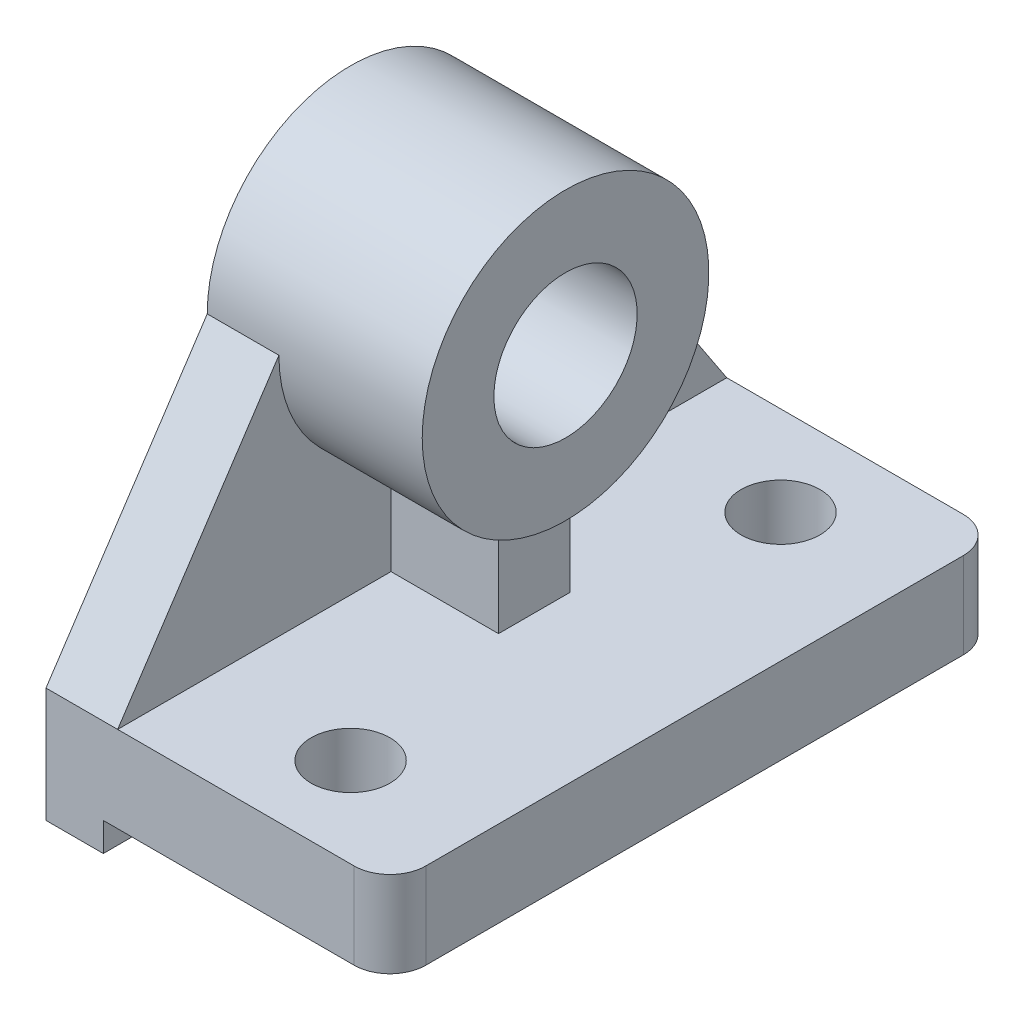
ISO-10303-21;
HEADER;
FILE_DESCRIPTION(('STEP AP214'),'2;1');
FILE_NAME('part.step','',(''),(''),'','','');
FILE_SCHEMA(('AUTOMOTIVE_DESIGN { 1 0 10303 214 1 1 1 1 }'));
ENDSEC;
DATA;
#1=APPLICATION_CONTEXT('core data for automotive mechanical design processes');
#2=APPLICATION_PROTOCOL_DEFINITION('international standard','automotive_design',2000,#1);
#3=PRODUCT_CONTEXT('',#1,'mechanical');
#4=PRODUCT('Part','Part','',(#3));
#5=PRODUCT_RELATED_PRODUCT_CATEGORY('part','',(#4));
#6=PRODUCT_DEFINITION_FORMATION('','',#4);
#7=PRODUCT_DEFINITION_CONTEXT('part definition',#1,'design');
#8=PRODUCT_DEFINITION('design','',#6,#7);
#9=PRODUCT_DEFINITION_SHAPE('','',#8);
#10=(LENGTH_UNIT() NAMED_UNIT(*) SI_UNIT(.MILLI.,.METRE.));
#11=(NAMED_UNIT(*) PLANE_ANGLE_UNIT() SI_UNIT($,.RADIAN.));
#12=(NAMED_UNIT(*) SI_UNIT($,.STERADIAN.) SOLID_ANGLE_UNIT());
#13=UNCERTAINTY_MEASURE_WITH_UNIT(LENGTH_MEASURE(1.E-05),#10,'distance_accuracy_value','');
#14=(GEOMETRIC_REPRESENTATION_CONTEXT(3) GLOBAL_UNCERTAINTY_ASSIGNED_CONTEXT((#13)) GLOBAL_UNIT_ASSIGNED_CONTEXT((#10,
#11,#12)) REPRESENTATION_CONTEXT('',''));
#15=CARTESIAN_POINT('',(0.,0.,0.));
#16=DIRECTION('',(0.,0.,1.));
#17=DIRECTION('',(1.,0.,0.));
#18=AXIS2_PLACEMENT_3D('',#15,#16,#17);
#19=CARTESIAN_POINT('',(24.2345679012346,0.,-5.41975308641975));
#20=DIRECTION('',(0.,1.,0.));
#21=DIRECTION('',(0.,0.,1.));
#22=AXIS2_PLACEMENT_3D('',#19,#20,#21);
#23=PLANE('',#22);
#24=CARTESIAN_POINT('',(11.2345679012346,0.,2.08024691358025));
#25=DIRECTION('',(0.,1.,0.));
#26=DIRECTION('',(0.,0.,1.));
#27=AXIS2_PLACEMENT_3D('',#24,#25,#26);
#28=CIRCLE('',#27,5.5);
#29=CARTESIAN_POINT('',(11.2345679012346,0.,7.58024691358024));
#30=VERTEX_POINT('',#29);
#31=EDGE_CURVE('E192',#30,#30,#28,.T.);
#32=ORIENTED_EDGE('',*,*,#31,.F.);
#33=EDGE_LOOP('',(#32));
#34=FACE_BOUND('',#33,.T.);
#35=CARTESIAN_POINT('',(11.2345679012346,0.,62.0802469135803));
#36=DIRECTION('',(0.,1.,0.));
#37=DIRECTION('',(0.,0.,1.));
#38=AXIS2_PLACEMENT_3D('',#35,#36,#37);
#39=CIRCLE('',#38,5.5);
#40=CARTESIAN_POINT('',(11.2345679012346,0.,67.5802469135803));
#41=VERTEX_POINT('',#40);
#42=EDGE_CURVE('E195',#41,#41,#39,.T.);
#43=ORIENTED_EDGE('',*,*,#42,.F.);
#44=EDGE_LOOP('',(#43));
#45=FACE_BOUND('',#44,.T.);
#46=DIRECTION('',(0.,0.,-1.));
#47=VECTOR('',#46,1.);
#48=CARTESIAN_POINT('',(6.23456790123456,0.,0.));
#49=LINE('',#48,#47);
#50=CARTESIAN_POINT('',(6.23456790123456,0.,36.4362700764444));
#51=VERTEX_POINT('',#50);
#52=CARTESIAN_POINT('',(6.23456790123456,0.,26.4362700764444));
#53=VERTEX_POINT('',#52);
#54=EDGE_CURVE('E145',#51,#53,#49,.T.);
#55=ORIENTED_EDGE('',*,*,#54,.F.);
#56=DIRECTION('',(-1.,0.,0.));
#57=VECTOR('',#56,1.);
#58=CARTESIAN_POINT('',(6.23456790123456,0.,36.4362700764444));
#59=LINE('',#58,#57);
#60=CARTESIAN_POINT('',(-8.76543209876544,0.,36.4362700764444));
#61=VERTEX_POINT('',#60);
#62=EDGE_CURVE('E164',#51,#61,#59,.T.);
#63=ORIENTED_EDGE('',*,*,#62,.T.);
#64=DIRECTION('',(0.,0.,1.));
#65=VECTOR('',#64,1.);
#66=CARTESIAN_POINT('',(-8.76543209876544,0.,-10.4197530864197));
#67=LINE('',#66,#65);
#68=CARTESIAN_POINT('',(-8.76543209876544,0.,74.5802469135803));
#69=VERTEX_POINT('',#68);
#70=EDGE_CURVE('E219',#61,#69,#67,.T.);
#71=ORIENTED_EDGE('',*,*,#70,.T.);
#72=DIRECTION('',(1.,0.,0.));
#73=VECTOR('',#72,1.);
#74=CARTESIAN_POINT('',(24.2345679012345,0.,74.5802469135803));
#75=LINE('',#74,#73);
#76=CARTESIAN_POINT('',(24.2345679012345,0.,74.5802469135803));
#77=VERTEX_POINT('',#76);
#78=EDGE_CURVE('E232',#69,#77,#75,.T.);
#79=ORIENTED_EDGE('',*,*,#78,.T.);
#80=CARTESIAN_POINT('',(24.2345679012346,0.,69.5802469135803));
#81=DIRECTION('',(0.,1.,0.));
#82=DIRECTION('',(0.,0.,-1.));
#83=AXIS2_PLACEMENT_3D('',#80,#81,#82);
#84=CIRCLE('',#83,5.);
#85=CARTESIAN_POINT('',(29.2345679012346,0.,69.5802469135802));
#86=VERTEX_POINT('',#85);
#87=EDGE_CURVE('E255',#77,#86,#84,.T.);
#88=ORIENTED_EDGE('',*,*,#87,.T.);
#89=DIRECTION('',(0.,0.,-1.));
#90=VECTOR('',#89,1.);
#91=CARTESIAN_POINT('',(29.2345679012346,0.,-5.41975308641971));
#92=LINE('',#91,#90);
#93=CARTESIAN_POINT('',(29.2345679012346,0.,-5.41975308641971));
#94=VERTEX_POINT('',#93);
#95=EDGE_CURVE('E258',#86,#94,#92,.T.);
#96=ORIENTED_EDGE('',*,*,#95,.T.);
#97=CARTESIAN_POINT('',(24.2345679012346,0.,-5.41975308641975));
#98=DIRECTION('',(0.,1.,0.));
#99=DIRECTION('',(0.,0.,1.));
#100=AXIS2_PLACEMENT_3D('',#97,#98,#99);
#101=CIRCLE('',#100,5.);
#102=CARTESIAN_POINT('',(24.2345679012345,0.,-10.4197530864197));
#103=VERTEX_POINT('',#102);
#104=EDGE_CURVE('E261',#94,#103,#101,.T.);
#105=ORIENTED_EDGE('',*,*,#104,.T.);
#106=DIRECTION('',(-1.,0.,0.));
#107=VECTOR('',#106,1.);
#108=CARTESIAN_POINT('',(-18.7654320987654,0.,-10.4197530864197));
#109=LINE('',#108,#107);
#110=CARTESIAN_POINT('',(-8.76543209876544,0.,-10.4197530864197));
#111=VERTEX_POINT('',#110);
#112=EDGE_CURVE('E240',#103,#111,#109,.T.);
#113=ORIENTED_EDGE('',*,*,#112,.T.);
#114=CARTESIAN_POINT('',(-8.76543209876544,0.,26.4362700764444));
#115=VERTEX_POINT('',#114);
#116=EDGE_CURVE('E163',#111,#115,#67,.T.);
#117=ORIENTED_EDGE('',*,*,#116,.T.);
#118=DIRECTION('',(-1.,0.,0.));
#119=VECTOR('',#118,1.);
#120=CARTESIAN_POINT('',(6.23456790123456,0.,26.4362700764444));
#121=LINE('',#120,#119);
#122=EDGE_CURVE('E153',#53,#115,#121,.T.);
#123=ORIENTED_EDGE('',*,*,#122,.F.);
#124=EDGE_LOOP('',(#55,#63,#71,#79,#88,#96,#105,#113,#117,#123));
#125=FACE_BOUND('',#124,.T.);
#126=ADVANCED_FACE('F39',(#34,#45,#125),#23,.T.);
#127=CARTESIAN_POINT('',(-8.76543209876544,33.9659337162256,32.0802469135803));
#128=DIRECTION('',(-1.,0.,0.));
#129=DIRECTION('',(0.,0.,1.));
#130=AXIS2_PLACEMENT_3D('',#127,#128,#129);
#131=PLANE('',#130);
#132=DIRECTION('',(0.,-1.,0.));
#133=VECTOR('',#132,1.);
#134=CARTESIAN_POINT('',(-8.76543209876544,0.,36.4362700764444));
#135=LINE('',#134,#133);
#136=CARTESIAN_POINT('',(-8.76543209876544,14.4460704430213,36.4362700764444));
#137=VERTEX_POINT('',#136);
#138=EDGE_CURVE('E305',#137,#61,#135,.T.);
#139=ORIENTED_EDGE('',*,*,#138,.F.);
#140=CARTESIAN_POINT('',(-8.76543209876544,33.9659337162256,32.0802469135803));
#141=DIRECTION('',(1.,0.,0.));
#142=DIRECTION('',(0.,0.,1.));
#143=AXIS2_PLACEMENT_3D('',#140,#141,#142);
#144=CIRCLE('',#143,20.);
#145=CARTESIAN_POINT('',(-8.76543209876544,33.9659337162256,52.0802469135803));
#146=VERTEX_POINT('',#145);
#147=EDGE_CURVE('E212',#146,#137,#144,.T.);
#148=ORIENTED_EDGE('',*,*,#147,.F.);
#149=DIRECTION('',(0.,0.833677464435391,-0.552251650330333));
#150=VECTOR('',#149,1.);
#151=CARTESIAN_POINT('',(-8.76543209876545,0.,74.5802469135803));
#152=LINE('',#151,#150);
#153=EDGE_CURVE('E221',#69,#146,#152,.T.);
#154=ORIENTED_EDGE('',*,*,#153,.F.);
#155=ORIENTED_EDGE('',*,*,#70,.F.);
#156=EDGE_LOOP('',(#139,#148,#154,#155));
#157=FACE_BOUND('',#156,.T.);
#158=ADVANCED_FACE('F303',(#157),#131,.F.);
#159=DIRECTION('',(0.,1.,0.));
#160=VECTOR('',#159,1.);
#161=CARTESIAN_POINT('',(-8.76543209876544,0.,26.4362700764444));
#162=LINE('',#161,#160);
#163=CARTESIAN_POINT('',(-8.76543209876544,14.778814978336,26.4362700764444));
#164=VERTEX_POINT('',#163);
#165=EDGE_CURVE('E286',#115,#164,#162,.T.);
#166=ORIENTED_EDGE('',*,*,#165,.F.);
#167=ORIENTED_EDGE('',*,*,#116,.F.);
#168=DIRECTION('',(0.,-0.833677464435391,-0.552251650330334));
#169=VECTOR('',#168,1.);
#170=CARTESIAN_POINT('',(-8.76543209876544,33.9659337162256,12.0802469135803));
#171=LINE('',#170,#169);
#172=CARTESIAN_POINT('',(-8.76543209876544,33.9659337162256,12.0802469135803));
#173=VERTEX_POINT('',#172);
#174=EDGE_CURVE('E215',#173,#111,#171,.T.);
#175=ORIENTED_EDGE('',*,*,#174,.F.);
#176=EDGE_CURVE('E216',#164,#173,#144,.T.);
#177=ORIENTED_EDGE('',*,*,#176,.F.);
#178=EDGE_LOOP('',(#166,#167,#175,#177));
#179=FACE_BOUND('',#178,.T.);
#180=ADVANCED_FACE('F285',(#179),#131,.F.);
#181=CARTESIAN_POINT('',(11.2345679012346,33.9659337162256,32.0802469135803));
#182=DIRECTION('',(-1.,0.,0.));
#183=DIRECTION('',(0.,0.,1.));
#184=AXIS2_PLACEMENT_3D('',#181,#182,#183);
#185=CYLINDRICAL_SURFACE('',#184,20.);
#186=CARTESIAN_POINT('',(11.2345679012346,33.9659337162256,32.0802469135803));
#187=DIRECTION('',(-1.,0.,0.));
#188=DIRECTION('',(0.,0.,1.));
#189=AXIS2_PLACEMENT_3D('',#186,#187,#188);
#190=CIRCLE('',#189,20.);
#191=CARTESIAN_POINT('',(11.2345679012346,33.9659337162256,52.0802469135803));
#192=VERTEX_POINT('',#191);
#193=EDGE_CURVE('E206',#192,#192,#190,.T.);
#194=ORIENTED_EDGE('',*,*,#193,.T.);
#195=EDGE_LOOP('',(#194));
#196=FACE_BOUND('',#195,.T.);
#197=ORIENTED_EDGE('',*,*,#147,.T.);
#198=DIRECTION('',(-1.,0.,0.));
#199=VECTOR('',#198,1.);
#200=CARTESIAN_POINT('',(11.2345679012346,14.4460704430213,36.4362700764444));
#201=LINE('',#200,#199);
#202=CARTESIAN_POINT('',(6.23456790123456,14.4460704430213,36.4362700764444));
#203=VERTEX_POINT('',#202);
#204=EDGE_CURVE('E11',#137,#203,#201,.F.);
#205=ORIENTED_EDGE('',*,*,#204,.T.);
#206=CARTESIAN_POINT('',(6.23456790123456,33.9659337162256,32.0802469135803));
#207=DIRECTION('',(-1.,0.,0.));
#208=DIRECTION('',(0.,0.,1.));
#209=AXIS2_PLACEMENT_3D('',#206,#207,#208);
#210=CIRCLE('',#209,20.);
#211=CARTESIAN_POINT('',(6.23456790123456,14.778814978336,26.4362700764444));
#212=VERTEX_POINT('',#211);
#213=EDGE_CURVE('E268',#203,#212,#210,.F.);
#214=ORIENTED_EDGE('',*,*,#213,.T.);
#215=DIRECTION('',(-1.,0.,0.));
#216=VECTOR('',#215,1.);
#217=CARTESIAN_POINT('',(11.2345679012346,14.778814978336,26.4362700764444));
#218=LINE('',#217,#216);
#219=EDGE_CURVE('E47',#212,#164,#218,.T.);
#220=ORIENTED_EDGE('',*,*,#219,.T.);
#221=ORIENTED_EDGE('',*,*,#176,.T.);
#222=DIRECTION('',(-1.,0.,0.));
#223=VECTOR('',#222,1.);
#224=CARTESIAN_POINT('',(-8.76543209876544,33.9659337162256,12.0802469135803));
#225=LINE('',#224,#223);
#226=CARTESIAN_POINT('',(-18.7654320987654,33.9659337162256,12.0802469135803));
#227=VERTEX_POINT('',#226);
#228=EDGE_CURVE('E224',#173,#227,#225,.T.);
#229=ORIENTED_EDGE('',*,*,#228,.T.);
#230=CARTESIAN_POINT('',(-18.7654320987654,33.9659337162256,32.0802469135803));
#231=DIRECTION('',(-1.,0.,0.));
#232=DIRECTION('',(0.,0.,1.));
#233=AXIS2_PLACEMENT_3D('',#230,#231,#232);
#234=CIRCLE('',#233,20.);
#235=CARTESIAN_POINT('',(-18.7654320987654,33.9659337162256,52.0802469135803));
#236=VERTEX_POINT('',#235);
#237=EDGE_CURVE('E203',#236,#227,#234,.T.);
#238=ORIENTED_EDGE('',*,*,#237,.F.);
#239=DIRECTION('',(-1.,0.,0.));
#240=VECTOR('',#239,1.);
#241=CARTESIAN_POINT('',(-8.76543209876544,33.9659337162256,52.0802469135803));
#242=LINE('',#241,#240);
#243=EDGE_CURVE('E230',#146,#236,#242,.T.);
#244=ORIENTED_EDGE('',*,*,#243,.F.);
#245=EDGE_LOOP('',(#197,#205,#214,#220,#221,#229,#238,#244));
#246=FACE_BOUND('',#245,.T.);
#247=ADVANCED_FACE('F282',(#196,#246),#185,.T.);
#248=CARTESIAN_POINT('',(24.2345679012346,-12.,-5.41975308641975));
#249=DIRECTION('',(0.,1.,0.));
#250=DIRECTION('',(0.,0.,1.));
#251=AXIS2_PLACEMENT_3D('',#248,#249,#250);
#252=PLANE('',#251);
#253=CARTESIAN_POINT('',(11.2345679012346,-12.,62.0802469135803));
#254=DIRECTION('',(0.,1.,0.));
#255=DIRECTION('',(0.,0.,1.));
#256=AXIS2_PLACEMENT_3D('',#253,#254,#255);
#257=CIRCLE('',#256,5.5);
#258=CARTESIAN_POINT('',(11.2345679012346,-12.,67.5802469135803));
#259=VERTEX_POINT('',#258);
#260=EDGE_CURVE('E183',#259,#259,#257,.T.);
#261=ORIENTED_EDGE('',*,*,#260,.T.);
#262=EDGE_LOOP('',(#261));
#263=FACE_BOUND('',#262,.T.);
#264=CARTESIAN_POINT('',(11.2345679012346,-12.,2.08024691358025));
#265=DIRECTION('',(0.,1.,0.));
#266=DIRECTION('',(0.,0.,1.));
#267=AXIS2_PLACEMENT_3D('',#264,#265,#266);
#268=CIRCLE('',#267,5.5);
#269=CARTESIAN_POINT('',(11.2345679012346,-12.,7.58024691358024));
#270=VERTEX_POINT('',#269);
#271=EDGE_CURVE('E188',#270,#270,#268,.T.);
#272=ORIENTED_EDGE('',*,*,#271,.T.);
#273=EDGE_LOOP('',(#272));
#274=FACE_BOUND('',#273,.T.);
#275=DIRECTION('',(0.,0.,1.));
#276=VECTOR('',#275,1.);
#277=CARTESIAN_POINT('',(-10.7654320987654,-12.,-10.4197530864197));
#278=LINE('',#277,#276);
#279=CARTESIAN_POINT('',(-10.7654320987654,-12.,-10.4197530864197));
#280=VERTEX_POINT('',#279);
#281=CARTESIAN_POINT('',(-10.7654320987654,-12.,74.5802469135803));
#282=VERTEX_POINT('',#281);
#283=EDGE_CURVE('E62',#280,#282,#278,.T.);
#284=ORIENTED_EDGE('',*,*,#283,.F.);
#285=DIRECTION('',(-1.,0.,0.));
#286=VECTOR('',#285,1.);
#287=CARTESIAN_POINT('',(-18.7654320987654,-12.,-10.4197530864197));
#288=LINE('',#287,#286);
#289=CARTESIAN_POINT('',(24.2345679012345,-12.,-10.4197530864197));
#290=VERTEX_POINT('',#289);
#291=EDGE_CURVE('E249',#290,#280,#288,.T.);
#292=ORIENTED_EDGE('',*,*,#291,.F.);
#293=CARTESIAN_POINT('',(24.2345679012346,-12.,-5.41975308641975));
#294=DIRECTION('',(0.,1.,0.));
#295=DIRECTION('',(0.,0.,1.));
#296=AXIS2_PLACEMENT_3D('',#293,#294,#295);
#297=CIRCLE('',#296,5.);
#298=CARTESIAN_POINT('',(29.2345679012346,-12.,-5.41975308641971));
#299=VERTEX_POINT('',#298);
#300=EDGE_CURVE('E246',#299,#290,#297,.T.);
#301=ORIENTED_EDGE('',*,*,#300,.F.);
#302=DIRECTION('',(0.,0.,-1.));
#303=VECTOR('',#302,1.);
#304=CARTESIAN_POINT('',(29.2345679012346,-12.,-5.41975308641971));
#305=LINE('',#304,#303);
#306=CARTESIAN_POINT('',(29.2345679012346,-12.,69.5802469135802));
#307=VERTEX_POINT('',#306);
#308=EDGE_CURVE('E243',#307,#299,#305,.T.);
#309=ORIENTED_EDGE('',*,*,#308,.F.);
#310=CARTESIAN_POINT('',(24.2345679012346,-12.,69.5802469135803));
#311=DIRECTION('',(0.,1.,0.));
#312=DIRECTION('',(0.,0.,-1.));
#313=AXIS2_PLACEMENT_3D('',#310,#311,#312);
#314=CIRCLE('',#313,5.);
#315=CARTESIAN_POINT('',(24.2345679012345,-12.,74.5802469135803));
#316=VERTEX_POINT('',#315);
#317=EDGE_CURVE('E239',#316,#307,#314,.T.);
#318=ORIENTED_EDGE('',*,*,#317,.F.);
#319=DIRECTION('',(1.,0.,0.));
#320=VECTOR('',#319,1.);
#321=CARTESIAN_POINT('',(24.2345679012345,-12.,74.5802469135803));
#322=LINE('',#321,#320);
#323=EDGE_CURVE('E237',#282,#316,#322,.T.);
#324=ORIENTED_EDGE('',*,*,#323,.F.);
#325=EDGE_LOOP('',(#284,#292,#301,#309,#318,#324));
#326=FACE_BOUND('',#325,.T.);
#327=ADVANCED_FACE('F336',(#263,#274,#326),#252,.F.);
#328=CARTESIAN_POINT('',(24.2345679012345,-12.,74.5802469135803));
#329=DIRECTION('',(0.,0.,1.));
#330=DIRECTION('',(1.,0.,0.));
#331=AXIS2_PLACEMENT_3D('',#328,#329,#330);
#332=PLANE('',#331);
#333=CARTESIAN_POINT('',(-18.7654320987654,0.,74.5802469135803));
#334=VERTEX_POINT('',#333);
#335=EDGE_CURVE('E252',#334,#69,#75,.T.);
#336=ORIENTED_EDGE('',*,*,#335,.F.);
#337=DIRECTION('',(0.,1.,0.));
#338=VECTOR('',#337,1.);
#339=CARTESIAN_POINT('',(-18.7654320987654,-12.,74.5802469135803));
#340=LINE('',#339,#338);
#341=CARTESIAN_POINT('',(-18.7654320987654,-16.,74.5802469135803));
#342=VERTEX_POINT('',#341);
#343=EDGE_CURVE('E265',#342,#334,#340,.T.);
#344=ORIENTED_EDGE('',*,*,#343,.F.);
#345=DIRECTION('',(1.,0.,0.));
#346=VECTOR('',#345,1.);
#347=CARTESIAN_POINT('',(-18.7654320987654,-16.,74.5802469135803));
#348=LINE('',#347,#346);
#349=CARTESIAN_POINT('',(-10.7654320987654,-16.,74.5802469135803));
#350=VERTEX_POINT('',#349);
#351=EDGE_CURVE('E166',#342,#350,#348,.T.);
#352=ORIENTED_EDGE('',*,*,#351,.T.);
#353=DIRECTION('',(0.,1.,0.));
#354=VECTOR('',#353,1.);
#355=CARTESIAN_POINT('',(-10.7654320987654,-16.,74.5802469135803));
#356=LINE('',#355,#354);
#357=EDGE_CURVE('E174',#350,#282,#356,.T.);
#358=ORIENTED_EDGE('',*,*,#357,.T.);
#359=ORIENTED_EDGE('',*,*,#323,.T.);
#360=DIRECTION('',(0.,1.,0.));
#361=VECTOR('',#360,1.);
#362=CARTESIAN_POINT('',(24.2345679012345,-12.,74.5802469135803));
#363=LINE('',#362,#361);
#364=EDGE_CURVE('E251',#316,#77,#363,.T.);
#365=ORIENTED_EDGE('',*,*,#364,.T.);
#366=ORIENTED_EDGE('',*,*,#78,.F.);
#367=EDGE_LOOP('',(#336,#344,#352,#358,#359,#365,#366));
#368=FACE_BOUND('',#367,.T.);
#369=ADVANCED_FACE('F41',(#368),#332,.T.);
#370=CARTESIAN_POINT('',(-18.7654320987654,-12.,74.5802469135803));
#371=DIRECTION('',(-1.,0.,0.));
#372=DIRECTION('',(0.,0.,1.));
#373=AXIS2_PLACEMENT_3D('',#370,#371,#372);
#374=PLANE('',#373);
#375=ORIENTED_EDGE('',*,*,#343,.T.);
#376=DIRECTION('',(0.,0.833677464435391,-0.552251650330333));
#377=VECTOR('',#376,1.);
#378=CARTESIAN_POINT('',(-18.7654320987654,0.,74.5802469135803));
#379=LINE('',#378,#377);
#380=EDGE_CURVE('E227',#334,#236,#379,.T.);
#381=ORIENTED_EDGE('',*,*,#380,.T.);
#382=ORIENTED_EDGE('',*,*,#237,.T.);
#383=DIRECTION('',(0.,-0.833677464435391,-0.552251650330334));
#384=VECTOR('',#383,1.);
#385=CARTESIAN_POINT('',(-18.7654320987654,33.9659337162256,12.0802469135803));
#386=LINE('',#385,#384);
#387=CARTESIAN_POINT('',(-18.7654320987654,0.,-10.4197530864197));
#388=VERTEX_POINT('',#387);
#389=EDGE_CURVE('E209',#227,#388,#386,.T.);
#390=ORIENTED_EDGE('',*,*,#389,.T.);
#391=DIRECTION('',(0.,1.,0.));
#392=VECTOR('',#391,1.);
#393=CARTESIAN_POINT('',(-18.7654320987654,-12.,-10.4197530864197));
#394=LINE('',#393,#392);
#395=CARTESIAN_POINT('',(-18.7654320987654,-16.,-10.4197530864197));
#396=VERTEX_POINT('',#395);
#397=EDGE_CURVE('E269',#396,#388,#394,.T.);
#398=ORIENTED_EDGE('',*,*,#397,.F.);
#399=DIRECTION('',(0.,0.,1.));
#400=VECTOR('',#399,1.);
#401=CARTESIAN_POINT('',(-18.7654320987654,-16.,-10.4197530864197));
#402=LINE('',#401,#400);
#403=EDGE_CURVE('E177',#396,#342,#402,.T.);
#404=ORIENTED_EDGE('',*,*,#403,.T.);
#405=EDGE_LOOP('',(#375,#381,#382,#390,#398,#404));
#406=FACE_BOUND('',#405,.T.);
#407=CARTESIAN_POINT('',(-18.7654320987654,33.9659337162256,32.0802469135803));
#408=DIRECTION('',(-1.,0.,0.));
#409=DIRECTION('',(0.,0.,1.));
#410=AXIS2_PLACEMENT_3D('',#407,#408,#409);
#411=CIRCLE('',#410,10.);
#412=CARTESIAN_POINT('',(-18.7654320987654,33.9659337162256,42.0802469135803));
#413=VERTEX_POINT('',#412);
#414=EDGE_CURVE('E191',#413,#413,#411,.T.);
#415=ORIENTED_EDGE('',*,*,#414,.F.);
#416=EDGE_LOOP('',(#415));
#417=FACE_BOUND('',#416,.T.);
#418=ADVANCED_FACE('F294',(#406,#417),#374,.T.);
#419=CARTESIAN_POINT('',(-18.7654320987654,-12.,-10.4197530864197));
#420=DIRECTION('',(0.,0.,-1.));
#421=DIRECTION('',(-1.,0.,0.));
#422=AXIS2_PLACEMENT_3D('',#419,#420,#421);
#423=PLANE('',#422);
#424=ORIENTED_EDGE('',*,*,#112,.F.);
#425=DIRECTION('',(0.,1.,0.));
#426=VECTOR('',#425,1.);
#427=CARTESIAN_POINT('',(24.2345679012345,-12.,-10.4197530864197));
#428=LINE('',#427,#426);
#429=EDGE_CURVE('E272',#290,#103,#428,.T.);
#430=ORIENTED_EDGE('',*,*,#429,.F.);
#431=ORIENTED_EDGE('',*,*,#291,.T.);
#432=DIRECTION('',(0.,1.,0.));
#433=VECTOR('',#432,1.);
#434=CARTESIAN_POINT('',(-10.7654320987654,-16.,-10.4197530864197));
#435=LINE('',#434,#433);
#436=CARTESIAN_POINT('',(-10.7654320987654,-16.,-10.4197530864197));
#437=VERTEX_POINT('',#436);
#438=EDGE_CURVE('E173',#437,#280,#435,.T.);
#439=ORIENTED_EDGE('',*,*,#438,.F.);
#440=DIRECTION('',(1.,0.,0.));
#441=VECTOR('',#440,1.);
#442=CARTESIAN_POINT('',(-18.7654320987654,-16.,-10.4197530864197));
#443=LINE('',#442,#441);
#444=EDGE_CURVE('E170',#396,#437,#443,.T.);
#445=ORIENTED_EDGE('',*,*,#444,.F.);
#446=ORIENTED_EDGE('',*,*,#397,.T.);
#447=DIRECTION('',(-1.,0.,0.));
#448=VECTOR('',#447,1.);
#449=CARTESIAN_POINT('',(-8.76543209876544,0.,-10.4197530864197));
#450=LINE('',#449,#448);
#451=EDGE_CURVE('E233',#111,#388,#450,.T.);
#452=ORIENTED_EDGE('',*,*,#451,.F.);
#453=EDGE_LOOP('',(#424,#430,#431,#439,#445,#446,#452));
#454=FACE_BOUND('',#453,.T.);
#455=ADVANCED_FACE('F326',(#454),#423,.T.);
#456=CARTESIAN_POINT('',(24.2345679012346,-12.,-5.41975308641975));
#457=DIRECTION('',(0.,1.,0.));
#458=DIRECTION('',(0.,0.,1.));
#459=AXIS2_PLACEMENT_3D('',#456,#457,#458);
#460=CYLINDRICAL_SURFACE('',#459,5.);
#461=ORIENTED_EDGE('',*,*,#104,.F.);
#462=DIRECTION('',(0.,1.,0.));
#463=VECTOR('',#462,1.);
#464=CARTESIAN_POINT('',(29.2345679012346,-12.,-5.41975308641971));
#465=LINE('',#464,#463);
#466=EDGE_CURVE('E274',#299,#94,#465,.T.);
#467=ORIENTED_EDGE('',*,*,#466,.F.);
#468=ORIENTED_EDGE('',*,*,#300,.T.);
#469=ORIENTED_EDGE('',*,*,#429,.T.);
#470=EDGE_LOOP('',(#461,#467,#468,#469));
#471=FACE_BOUND('',#470,.T.);
#472=ADVANCED_FACE('F323',(#471),#460,.T.);
#473=CARTESIAN_POINT('',(29.2345679012346,-12.,-5.41975308641971));
#474=DIRECTION('',(1.,0.,0.));
#475=DIRECTION('',(0.,0.,-1.));
#476=AXIS2_PLACEMENT_3D('',#473,#474,#475);
#477=PLANE('',#476);
#478=ORIENTED_EDGE('',*,*,#95,.F.);
#479=DIRECTION('',(0.,1.,0.));
#480=VECTOR('',#479,1.);
#481=CARTESIAN_POINT('',(29.2345679012346,-12.,69.5802469135802));
#482=LINE('',#481,#480);
#483=EDGE_CURVE('E276',#307,#86,#482,.T.);
#484=ORIENTED_EDGE('',*,*,#483,.F.);
#485=ORIENTED_EDGE('',*,*,#308,.T.);
#486=ORIENTED_EDGE('',*,*,#466,.T.);
#487=EDGE_LOOP('',(#478,#484,#485,#486));
#488=FACE_BOUND('',#487,.T.);
#489=ADVANCED_FACE('F319',(#488),#477,.T.);
#490=CARTESIAN_POINT('',(24.2345679012346,-12.,69.5802469135803));
#491=DIRECTION('',(0.,1.,0.));
#492=DIRECTION('',(0.,0.,1.));
#493=AXIS2_PLACEMENT_3D('',#490,#491,#492);
#494=CYLINDRICAL_SURFACE('',#493,5.);
#495=ORIENTED_EDGE('',*,*,#87,.F.);
#496=ORIENTED_EDGE('',*,*,#364,.F.);
#497=ORIENTED_EDGE('',*,*,#317,.T.);
#498=ORIENTED_EDGE('',*,*,#483,.T.);
#499=EDGE_LOOP('',(#495,#496,#497,#498));
#500=FACE_BOUND('',#499,.T.);
#501=ADVANCED_FACE('F315',(#500),#494,.T.);
#502=CARTESIAN_POINT('',(-8.76543209876545,0.,74.5802469135803));
#503=DIRECTION('',(0.,0.552251650330333,0.833677464435392));
#504=DIRECTION('',(0.,-0.833677464435392,0.552251650330333));
#505=AXIS2_PLACEMENT_3D('',#502,#503,#504);
#506=PLANE('',#505);
#507=ORIENTED_EDGE('',*,*,#380,.F.);
#508=ORIENTED_EDGE('',*,*,#335,.T.);
#509=ORIENTED_EDGE('',*,*,#153,.T.);
#510=ORIENTED_EDGE('',*,*,#243,.T.);
#511=EDGE_LOOP('',(#507,#508,#509,#510));
#512=FACE_BOUND('',#511,.T.);
#513=ADVANCED_FACE('F298',(#512),#506,.T.);
#514=CARTESIAN_POINT('',(-8.76543209876544,33.9659337162256,12.0802469135803));
#515=DIRECTION('',(0.,0.552251650330334,-0.833677464435391));
#516=DIRECTION('',(0.,0.833677464435391,0.552251650330334));
#517=AXIS2_PLACEMENT_3D('',#514,#515,#516);
#518=PLANE('',#517);
#519=ORIENTED_EDGE('',*,*,#389,.F.);
#520=ORIENTED_EDGE('',*,*,#228,.F.);
#521=ORIENTED_EDGE('',*,*,#174,.T.);
#522=ORIENTED_EDGE('',*,*,#451,.T.);
#523=EDGE_LOOP('',(#519,#520,#521,#522));
#524=FACE_BOUND('',#523,.T.);
#525=ADVANCED_FACE('F290',(#524),#518,.T.);
#526=CARTESIAN_POINT('',(11.2345679012346,33.9659337162256,32.0802469135803));
#527=DIRECTION('',(-1.,0.,0.));
#528=DIRECTION('',(0.,0.,1.));
#529=AXIS2_PLACEMENT_3D('',#526,#527,#528);
#530=PLANE('',#529);
#531=CARTESIAN_POINT('',(11.2345679012346,33.9659337162256,32.0802469135803));
#532=DIRECTION('',(-1.,0.,0.));
#533=DIRECTION('',(0.,0.,1.));
#534=AXIS2_PLACEMENT_3D('',#531,#532,#533);
#535=CIRCLE('',#534,10.);
#536=CARTESIAN_POINT('',(11.2345679012346,33.9659337162256,42.0802469135803));
#537=VERTEX_POINT('',#536);
#538=EDGE_CURVE('E200',#537,#537,#535,.T.);
#539=ORIENTED_EDGE('',*,*,#538,.T.);
#540=EDGE_LOOP('',(#539));
#541=FACE_BOUND('',#540,.T.);
#542=ORIENTED_EDGE('',*,*,#193,.F.);
#543=EDGE_LOOP('',(#542));
#544=FACE_BOUND('',#543,.T.);
#545=ADVANCED_FACE('F373',(#541,#544),#530,.F.);
#546=CARTESIAN_POINT('',(11.2345679012346,33.9659337162256,32.0802469135803));
#547=DIRECTION('',(-1.,0.,0.));
#548=DIRECTION('',(0.,0.,1.));
#549=AXIS2_PLACEMENT_3D('',#546,#547,#548);
#550=CYLINDRICAL_SURFACE('',#549,10.);
#551=ORIENTED_EDGE('',*,*,#538,.F.);
#552=EDGE_LOOP('',(#551));
#553=FACE_BOUND('',#552,.T.);
#554=ORIENTED_EDGE('',*,*,#414,.T.);
#555=EDGE_LOOP('',(#554));
#556=FACE_BOUND('',#555,.T.);
#557=ADVANCED_FACE('F377',(#553,#556),#550,.F.);
#558=CARTESIAN_POINT('',(11.2345679012346,-12.,62.0802469135803));
#559=DIRECTION('',(0.,1.,0.));
#560=DIRECTION('',(0.,0.,1.));
#561=AXIS2_PLACEMENT_3D('',#558,#559,#560);
#562=CYLINDRICAL_SURFACE('',#561,5.5);
#563=ORIENTED_EDGE('',*,*,#260,.F.);
#564=EDGE_LOOP('',(#563));
#565=FACE_BOUND('',#564,.T.);
#566=ORIENTED_EDGE('',*,*,#42,.T.);
#567=EDGE_LOOP('',(#566));
#568=FACE_BOUND('',#567,.T.);
#569=ADVANCED_FACE('F381',(#565,#568),#562,.F.);
#570=CARTESIAN_POINT('',(11.2345679012346,-12.,2.08024691358025));
#571=DIRECTION('',(0.,1.,0.));
#572=DIRECTION('',(0.,0.,1.));
#573=AXIS2_PLACEMENT_3D('',#570,#571,#572);
#574=CYLINDRICAL_SURFACE('',#573,5.5);
#575=ORIENTED_EDGE('',*,*,#271,.F.);
#576=EDGE_LOOP('',(#575));
#577=FACE_BOUND('',#576,.T.);
#578=ORIENTED_EDGE('',*,*,#31,.T.);
#579=EDGE_LOOP('',(#578));
#580=FACE_BOUND('',#579,.T.);
#581=ADVANCED_FACE('F385',(#577,#580),#574,.F.);
#582=CARTESIAN_POINT('',(-10.7654320987654,-16.,-10.4197530864197));
#583=DIRECTION('',(1.,0.,0.));
#584=DIRECTION('',(0.,0.,-1.));
#585=AXIS2_PLACEMENT_3D('',#582,#583,#584);
#586=PLANE('',#585);
#587=ORIENTED_EDGE('',*,*,#357,.F.);
#588=DIRECTION('',(0.,0.,1.));
#589=VECTOR('',#588,1.);
#590=CARTESIAN_POINT('',(-10.7654320987654,-16.,-10.4197530864197));
#591=LINE('',#590,#589);
#592=EDGE_CURVE('E184',#437,#350,#591,.T.);
#593=ORIENTED_EDGE('',*,*,#592,.F.);
#594=ORIENTED_EDGE('',*,*,#438,.T.);
#595=ORIENTED_EDGE('',*,*,#283,.T.);
#596=EDGE_LOOP('',(#587,#593,#594,#595));
#597=FACE_BOUND('',#596,.T.);
#598=ADVANCED_FACE('F335',(#597),#586,.T.);
#599=CARTESIAN_POINT('',(-18.7654320987654,-16.,-10.4197530864197));
#600=DIRECTION('',(0.,-1.,0.));
#601=DIRECTION('',(0.,0.,-1.));
#602=AXIS2_PLACEMENT_3D('',#599,#600,#601);
#603=PLANE('',#602);
#604=ORIENTED_EDGE('',*,*,#351,.F.);
#605=ORIENTED_EDGE('',*,*,#403,.F.);
#606=ORIENTED_EDGE('',*,*,#444,.T.);
#607=ORIENTED_EDGE('',*,*,#592,.T.);
#608=EDGE_LOOP('',(#604,#605,#606,#607));
#609=FACE_BOUND('',#608,.T.);
#610=ADVANCED_FACE('F332',(#609),#603,.T.);
#611=CARTESIAN_POINT('',(6.23456790123456,0.,36.4362700764444));
#612=DIRECTION('',(0.,0.,-1.));
#613=DIRECTION('',(-1.,0.,0.));
#614=AXIS2_PLACEMENT_3D('',#611,#612,#613);
#615=PLANE('',#614);
#616=ORIENTED_EDGE('',*,*,#204,.F.);
#617=ORIENTED_EDGE('',*,*,#138,.T.);
#618=ORIENTED_EDGE('',*,*,#62,.F.);
#619=DIRECTION('',(0.,-1.,0.));
#620=VECTOR('',#619,1.);
#621=CARTESIAN_POINT('',(6.23456790123456,0.,36.4362700764444));
#622=LINE('',#621,#620);
#623=EDGE_CURVE('E148',#203,#51,#622,.T.);
#624=ORIENTED_EDGE('',*,*,#623,.F.);
#625=EDGE_LOOP('',(#616,#617,#618,#624));
#626=FACE_BOUND('',#625,.T.);
#627=ADVANCED_FACE('F309',(#626),#615,.F.);
#628=CARTESIAN_POINT('',(6.23456790123456,0.,26.4362700764444));
#629=DIRECTION('',(0.,0.,1.));
#630=DIRECTION('',(0.,-1.,0.));
#631=AXIS2_PLACEMENT_3D('',#628,#629,#630);
#632=PLANE('',#631);
#633=ORIENTED_EDGE('',*,*,#219,.F.);
#634=DIRECTION('',(0.,1.,0.));
#635=VECTOR('',#634,1.);
#636=CARTESIAN_POINT('',(6.23456790123456,0.,26.4362700764444));
#637=LINE('',#636,#635);
#638=EDGE_CURVE('E54',#53,#212,#637,.T.);
#639=ORIENTED_EDGE('',*,*,#638,.F.);
#640=ORIENTED_EDGE('',*,*,#122,.T.);
#641=ORIENTED_EDGE('',*,*,#165,.T.);
#642=EDGE_LOOP('',(#633,#639,#640,#641));
#643=FACE_BOUND('',#642,.T.);
#644=ADVANCED_FACE('F156',(#643),#632,.F.);
#645=CARTESIAN_POINT('',(6.23456790123456,0.,0.));
#646=DIRECTION('',(-1.,0.,0.));
#647=DIRECTION('',(0.,0.,1.));
#648=AXIS2_PLACEMENT_3D('',#645,#646,#647);
#649=PLANE('',#648);
#650=ORIENTED_EDGE('',*,*,#213,.F.);
#651=ORIENTED_EDGE('',*,*,#623,.T.);
#652=ORIENTED_EDGE('',*,*,#54,.T.);
#653=ORIENTED_EDGE('',*,*,#638,.T.);
#654=EDGE_LOOP('',(#650,#651,#652,#653));
#655=FACE_BOUND('',#654,.T.);
#656=ADVANCED_FACE('F146',(#655),#649,.F.);
#657=CLOSED_SHELL('',(#126,#158,#180,#247,#327,#369,#418,#455,#472,#489,#501,#513,#525,#545,
#557,#569,#581,#598,#610,#627,#644,#656));
#658=MANIFOLD_SOLID_BREP('B2',#657);
#659=ADVANCED_BREP_SHAPE_REPRESENTATION('',(#18,#658),#14);
#660=SHAPE_DEFINITION_REPRESENTATION(#9,#659);
ENDSEC;
END-ISO-10303-21;
